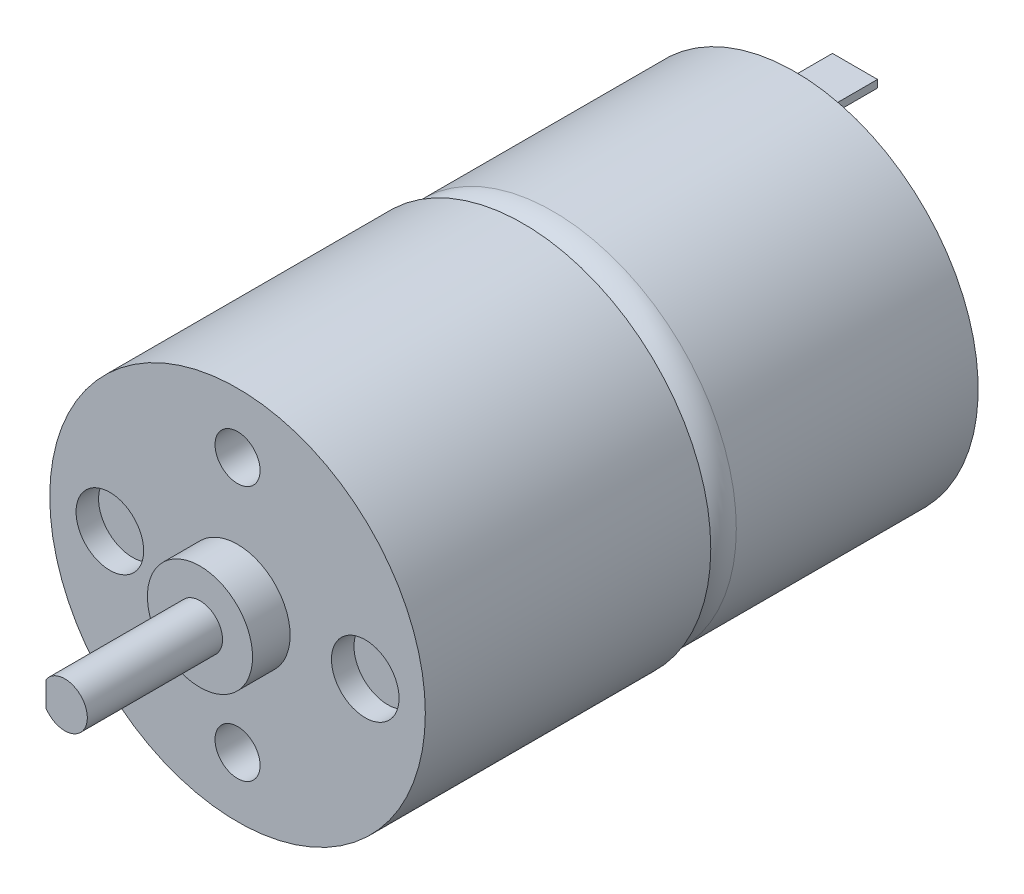
ISO-10303-21;
HEADER;
FILE_DESCRIPTION(('STEP AP214'),'2;1');
FILE_NAME('part.step','',(''),(''),'','','');
FILE_SCHEMA(('AUTOMOTIVE_DESIGN { 1 0 10303 214 1 1 1 1 }'));
ENDSEC;
DATA;
#1=APPLICATION_CONTEXT('core data for automotive mechanical design processes');
#2=APPLICATION_PROTOCOL_DEFINITION('international standard','automotive_design',2000,#1);
#3=PRODUCT_CONTEXT('',#1,'mechanical');
#4=PRODUCT('Part','Part','',(#3));
#5=PRODUCT_RELATED_PRODUCT_CATEGORY('part','',(#4));
#6=PRODUCT_DEFINITION_FORMATION('','',#4);
#7=PRODUCT_DEFINITION_CONTEXT('part definition',#1,'design');
#8=PRODUCT_DEFINITION('design','',#6,#7);
#9=PRODUCT_DEFINITION_SHAPE('','',#8);
#10=(LENGTH_UNIT() NAMED_UNIT(*) SI_UNIT(.MILLI.,.METRE.));
#11=(NAMED_UNIT(*) PLANE_ANGLE_UNIT() SI_UNIT($,.RADIAN.));
#12=(NAMED_UNIT(*) SI_UNIT($,.STERADIAN.) SOLID_ANGLE_UNIT());
#13=UNCERTAINTY_MEASURE_WITH_UNIT(LENGTH_MEASURE(1.E-05),#10,'distance_accuracy_value','');
#14=(GEOMETRIC_REPRESENTATION_CONTEXT(3) GLOBAL_UNCERTAINTY_ASSIGNED_CONTEXT((#13)) GLOBAL_UNIT_ASSIGNED_CONTEXT((#10,
#11,#12)) REPRESENTATION_CONTEXT('',''));
#15=CARTESIAN_POINT('',(0.,0.,0.));
#16=DIRECTION('',(0.,0.,1.));
#17=DIRECTION('',(1.,0.,0.));
#18=AXIS2_PLACEMENT_3D('',#15,#16,#17);
#19=CARTESIAN_POINT('',(0.,0.,0.));
#20=DIRECTION('',(0.,0.,1.));
#21=DIRECTION('',(1.,0.,0.));
#22=AXIS2_PLACEMENT_3D('',#19,#20,#21);
#23=PLANE('',#22);
#24=DIRECTION('',(0.,-1.,0.));
#25=VECTOR('',#24,1.);
#26=CARTESIAN_POINT('',(1.5,10.5,0.));
#27=LINE('',#26,#25);
#28=CARTESIAN_POINT('',(1.5,10.5,0.));
#29=VERTEX_POINT('',#28);
#30=CARTESIAN_POINT('',(1.5,10.,0.));
#31=VERTEX_POINT('',#30);
#32=EDGE_CURVE('E130',#29,#31,#27,.T.);
#33=ORIENTED_EDGE('',*,*,#32,.F.);
#34=DIRECTION('',(1.,0.,0.));
#35=VECTOR('',#34,1.);
#36=CARTESIAN_POINT('',(1.5,10.5,0.));
#37=LINE('',#36,#35);
#38=CARTESIAN_POINT('',(-1.5,10.5,0.));
#39=VERTEX_POINT('',#38);
#40=EDGE_CURVE('E143',#39,#29,#37,.T.);
#41=ORIENTED_EDGE('',*,*,#40,.F.);
#42=DIRECTION('',(0.,1.,0.));
#43=VECTOR('',#42,1.);
#44=CARTESIAN_POINT('',(-1.5,10.5,0.));
#45=LINE('',#44,#43);
#46=CARTESIAN_POINT('',(-1.5,10.,0.));
#47=VERTEX_POINT('',#46);
#48=EDGE_CURVE('E152',#47,#39,#45,.T.);
#49=ORIENTED_EDGE('',*,*,#48,.F.);
#50=DIRECTION('',(-1.,0.,0.));
#51=VECTOR('',#50,1.);
#52=CARTESIAN_POINT('',(1.5,10.,0.));
#53=LINE('',#52,#51);
#54=EDGE_CURVE('E133',#31,#47,#53,.T.);
#55=ORIENTED_EDGE('',*,*,#54,.F.);
#56=EDGE_LOOP('',(#33,#41,#49,#55));
#57=FACE_BOUND('',#56,.T.);
#58=CARTESIAN_POINT('',(0.,0.,0.));
#59=DIRECTION('',(0.,0.,1.));
#60=DIRECTION('',(1.,0.,0.));
#61=AXIS2_PLACEMENT_3D('',#58,#59,#60);
#62=CIRCLE('',#61,12.2);
#63=CARTESIAN_POINT('',(-12.2,0.,0.));
#64=VERTEX_POINT('',#63);
#65=EDGE_CURVE('E223',#64,#64,#62,.T.);
#66=ORIENTED_EDGE('',*,*,#65,.F.);
#67=EDGE_LOOP('',(#66));
#68=FACE_BOUND('',#67,.T.);
#69=CARTESIAN_POINT('',(0.,0.,0.));
#70=DIRECTION('',(0.,0.,1.));
#71=DIRECTION('',(1.,0.,0.));
#72=AXIS2_PLACEMENT_3D('',#69,#70,#71);
#73=CIRCLE('',#72,3.25);
#74=CARTESIAN_POINT('',(3.25,0.,0.));
#75=VERTEX_POINT('',#74);
#76=EDGE_CURVE('E11',#75,#75,#73,.F.);
#77=ORIENTED_EDGE('',*,*,#76,.F.);
#78=EDGE_LOOP('',(#77));
#79=FACE_BOUND('',#78,.T.);
#80=DIRECTION('',(0.,-1.,0.));
#81=VECTOR('',#80,1.);
#82=CARTESIAN_POINT('',(1.5,-10.,0.));
#83=LINE('',#82,#81);
#84=CARTESIAN_POINT('',(1.5,-10.,0.));
#85=VERTEX_POINT('',#84);
#86=CARTESIAN_POINT('',(1.5,-10.5,0.));
#87=VERTEX_POINT('',#86);
#88=EDGE_CURVE('E129',#85,#87,#83,.T.);
#89=ORIENTED_EDGE('',*,*,#88,.F.);
#90=DIRECTION('',(1.,0.,0.));
#91=VECTOR('',#90,1.);
#92=CARTESIAN_POINT('',(1.5,-10.,0.));
#93=LINE('',#92,#91);
#94=CARTESIAN_POINT('',(-1.5,-10.,0.));
#95=VERTEX_POINT('',#94);
#96=EDGE_CURVE('E126',#95,#85,#93,.T.);
#97=ORIENTED_EDGE('',*,*,#96,.F.);
#98=DIRECTION('',(0.,1.,0.));
#99=VECTOR('',#98,1.);
#100=CARTESIAN_POINT('',(-1.5,-10.,0.));
#101=LINE('',#100,#99);
#102=CARTESIAN_POINT('',(-1.5,-10.5,0.));
#103=VERTEX_POINT('',#102);
#104=EDGE_CURVE('E52',#103,#95,#101,.T.);
#105=ORIENTED_EDGE('',*,*,#104,.F.);
#106=DIRECTION('',(-1.,0.,0.));
#107=VECTOR('',#106,1.);
#108=CARTESIAN_POINT('',(1.5,-10.5,0.));
#109=LINE('',#108,#107);
#110=EDGE_CURVE('E47',#87,#103,#109,.T.);
#111=ORIENTED_EDGE('',*,*,#110,.F.);
#112=EDGE_LOOP('',(#89,#97,#105,#111));
#113=FACE_BOUND('',#112,.T.);
#114=ADVANCED_FACE('F32',(#57,#68,#79,#113),#23,.F.);
#115=CARTESIAN_POINT('',(0.,0.,39.6));
#116=DIRECTION('',(0.,0.,1.));
#117=DIRECTION('',(1.,0.,0.));
#118=AXIS2_PLACEMENT_3D('',#115,#116,#117);
#119=PLANE('',#118);
#120=CARTESIAN_POINT('',(0.,0.,39.6));
#121=DIRECTION('',(0.,0.,1.));
#122=DIRECTION('',(1.,0.,0.));
#123=AXIS2_PLACEMENT_3D('',#120,#121,#122);
#124=CIRCLE('',#123,3.5);
#125=CARTESIAN_POINT('',(3.5,0.,39.6));
#126=VERTEX_POINT('',#125);
#127=EDGE_CURVE('E214',#126,#126,#124,.T.);
#128=ORIENTED_EDGE('',*,*,#127,.T.);
#129=EDGE_LOOP('',(#128));
#130=FACE_BOUND('',#129,.T.);
#131=CARTESIAN_POINT('',(0.,0.,39.6));
#132=DIRECTION('',(0.,0.,1.));
#133=DIRECTION('',(1.,0.,0.));
#134=AXIS2_PLACEMENT_3D('',#131,#132,#133);
#135=CIRCLE('',#134,1.5);
#136=CARTESIAN_POINT('',(1.5,0.,39.6));
#137=VERTEX_POINT('',#136);
#138=EDGE_CURVE('E206',#137,#137,#135,.T.);
#139=ORIENTED_EDGE('',*,*,#138,.F.);
#140=EDGE_LOOP('',(#139));
#141=FACE_BOUND('',#140,.T.);
#142=ADVANCED_FACE('F256',(#130,#141),#119,.T.);
#143=CARTESIAN_POINT('',(0.,0.,37.1));
#144=DIRECTION('',(0.,0.,1.));
#145=DIRECTION('',(1.,0.,0.));
#146=AXIS2_PLACEMENT_3D('',#143,#144,#145);
#147=PLANE('',#146);
#148=CARTESIAN_POINT('',(0.,-8.5,37.1));
#149=DIRECTION('',(0.,0.,1.));
#150=DIRECTION('',(1.,0.,0.));
#151=AXIS2_PLACEMENT_3D('',#148,#149,#150);
#152=CIRCLE('',#151,1.5);
#153=CARTESIAN_POINT('',(1.5,-8.5,37.1));
#154=VERTEX_POINT('',#153);
#155=EDGE_CURVE('E171',#154,#154,#152,.T.);
#156=ORIENTED_EDGE('',*,*,#155,.F.);
#157=EDGE_LOOP('',(#156));
#158=FACE_BOUND('',#157,.T.);
#159=CARTESIAN_POINT('',(0.,8.5,37.1));
#160=DIRECTION('',(0.,0.,1.));
#161=DIRECTION('',(1.,0.,0.));
#162=AXIS2_PLACEMENT_3D('',#159,#160,#161);
#163=CIRCLE('',#162,1.5);
#164=CARTESIAN_POINT('',(1.5,8.5,37.1));
#165=VERTEX_POINT('',#164);
#166=EDGE_CURVE('E175',#165,#165,#163,.T.);
#167=ORIENTED_EDGE('',*,*,#166,.F.);
#168=EDGE_LOOP('',(#167));
#169=FACE_BOUND('',#168,.T.);
#170=CARTESIAN_POINT('',(-8.5,0.,37.1));
#171=DIRECTION('',(0.,0.,1.));
#172=DIRECTION('',(1.,0.,0.));
#173=AXIS2_PLACEMENT_3D('',#170,#171,#172);
#174=CIRCLE('',#173,2.25);
#175=CARTESIAN_POINT('',(-6.25,0.,37.1));
#176=VERTEX_POINT('',#175);
#177=EDGE_CURVE('E181',#176,#176,#174,.T.);
#178=ORIENTED_EDGE('',*,*,#177,.F.);
#179=EDGE_LOOP('',(#178));
#180=FACE_BOUND('',#179,.T.);
#181=CARTESIAN_POINT('',(8.5,0.,37.1));
#182=DIRECTION('',(0.,0.,1.));
#183=DIRECTION('',(1.,0.,0.));
#184=AXIS2_PLACEMENT_3D('',#181,#182,#183);
#185=CIRCLE('',#184,2.25);
#186=CARTESIAN_POINT('',(10.75,0.,37.1));
#187=VERTEX_POINT('',#186);
#188=EDGE_CURVE('E187',#187,#187,#185,.T.);
#189=ORIENTED_EDGE('',*,*,#188,.F.);
#190=EDGE_LOOP('',(#189));
#191=FACE_BOUND('',#190,.T.);
#192=CARTESIAN_POINT('',(0.,0.,37.1));
#193=DIRECTION('',(0.,0.,1.));
#194=DIRECTION('',(1.,0.,0.));
#195=AXIS2_PLACEMENT_3D('',#192,#193,#194);
#196=CIRCLE('',#195,12.5);
#197=CARTESIAN_POINT('',(12.5,0.,37.1));
#198=VERTEX_POINT('',#197);
#199=EDGE_CURVE('E220',#198,#198,#196,.T.);
#200=ORIENTED_EDGE('',*,*,#199,.T.);
#201=EDGE_LOOP('',(#200));
#202=FACE_BOUND('',#201,.T.);
#203=CARTESIAN_POINT('',(0.,0.,37.1));
#204=DIRECTION('',(0.,0.,1.));
#205=DIRECTION('',(1.,0.,0.));
#206=AXIS2_PLACEMENT_3D('',#203,#204,#205);
#207=CIRCLE('',#206,3.5);
#208=CARTESIAN_POINT('',(3.5,0.,37.1));
#209=VERTEX_POINT('',#208);
#210=EDGE_CURVE('E211',#209,#209,#207,.T.);
#211=ORIENTED_EDGE('',*,*,#210,.F.);
#212=EDGE_LOOP('',(#211));
#213=FACE_BOUND('',#212,.T.);
#214=ADVANCED_FACE('F261',(#158,#169,#180,#191,#202,#213),#147,.T.);
#215=CARTESIAN_POINT('',(0.,0.,18.1));
#216=DIRECTION('',(0.,0.,-1.));
#217=DIRECTION('',(-1.,0.,0.));
#218=AXIS2_PLACEMENT_3D('',#215,#216,#217);
#219=CYLINDRICAL_SURFACE('',#218,12.2);
#220=CARTESIAN_POINT('',(0.,0.,16.1));
#221=DIRECTION('',(0.,0.,1.));
#222=DIRECTION('',(1.,0.,0.));
#223=AXIS2_PLACEMENT_3D('',#220,#221,#222);
#224=CIRCLE('',#223,12.2);
#225=CARTESIAN_POINT('',(-12.2,0.,16.1));
#226=VERTEX_POINT('',#225);
#227=EDGE_CURVE('E40',#226,#226,#224,.F.);
#228=CARTESIAN_POINT('',(-12.2,0.,16.1));
#229=CARTESIAN_POINT('',(-12.2,0.,15.9322916666667));
#230=CARTESIAN_POINT('',(-12.2,0.,15.7645833333333));
#231=CARTESIAN_POINT('',(-12.2,0.,15.4291666666667));
#232=CARTESIAN_POINT('',(-12.2,0.,15.2614583333333));
#233=CARTESIAN_POINT('',(-12.2,0.,14.9260416666667));
#234=CARTESIAN_POINT('',(-12.2,0.,14.7583333333333));
#235=CARTESIAN_POINT('',(-12.2,0.,14.4229166666667));
#236=CARTESIAN_POINT('',(-12.2,0.,14.2552083333333));
#237=CARTESIAN_POINT('',(-12.2,0.,13.9197916666667));
#238=CARTESIAN_POINT('',(-12.2,0.,13.7520833333333));
#239=CARTESIAN_POINT('',(-12.2,0.,13.4166666666667));
#240=CARTESIAN_POINT('',(-12.2,0.,13.2489583333333));
#241=CARTESIAN_POINT('',(-12.2,0.,12.9135416666667));
#242=CARTESIAN_POINT('',(-12.2,0.,12.7458333333333));
#243=CARTESIAN_POINT('',(-12.2,0.,12.4104166666667));
#244=CARTESIAN_POINT('',(-12.2,0.,12.2427083333333));
#245=CARTESIAN_POINT('',(-12.2,0.,11.9072916666667));
#246=CARTESIAN_POINT('',(-12.2,0.,11.7395833333333));
#247=CARTESIAN_POINT('',(-12.2,0.,11.4041666666667));
#248=CARTESIAN_POINT('',(-12.2,0.,11.2364583333333));
#249=CARTESIAN_POINT('',(-12.2,0.,10.9010416666667));
#250=CARTESIAN_POINT('',(-12.2,0.,10.7333333333333));
#251=CARTESIAN_POINT('',(-12.2,0.,10.3979166666667));
#252=CARTESIAN_POINT('',(-12.2,0.,10.2302083333333));
#253=CARTESIAN_POINT('',(-12.2,0.,9.89479166666667));
#254=CARTESIAN_POINT('',(-12.2,0.,9.72708333333333));
#255=CARTESIAN_POINT('',(-12.2,0.,9.39166666666667));
#256=CARTESIAN_POINT('',(-12.2,0.,9.22395833333333));
#257=CARTESIAN_POINT('',(-12.2,0.,8.88854166666667));
#258=CARTESIAN_POINT('',(-12.2,0.,8.72083333333333));
#259=CARTESIAN_POINT('',(-12.2,0.,8.38541666666667));
#260=CARTESIAN_POINT('',(-12.2,0.,8.21770833333333));
#261=CARTESIAN_POINT('',(-12.2,0.,7.88229166666667));
#262=CARTESIAN_POINT('',(-12.2,0.,7.71458333333333));
#263=CARTESIAN_POINT('',(-12.2,0.,7.37916666666667));
#264=CARTESIAN_POINT('',(-12.2,0.,7.21145833333333));
#265=CARTESIAN_POINT('',(-12.2,0.,6.87604166666667));
#266=CARTESIAN_POINT('',(-12.2,0.,6.70833333333333));
#267=CARTESIAN_POINT('',(-12.2,0.,6.37291666666667));
#268=CARTESIAN_POINT('',(-12.2,0.,6.20520833333333));
#269=CARTESIAN_POINT('',(-12.2,0.,5.86979166666667));
#270=CARTESIAN_POINT('',(-12.2,0.,5.70208333333333));
#271=CARTESIAN_POINT('',(-12.2,0.,5.36666666666667));
#272=CARTESIAN_POINT('',(-12.2,0.,5.19895833333333));
#273=CARTESIAN_POINT('',(-12.2,0.,4.86354166666667));
#274=CARTESIAN_POINT('',(-12.2,0.,4.69583333333333));
#275=CARTESIAN_POINT('',(-12.2,0.,4.36041666666667));
#276=CARTESIAN_POINT('',(-12.2,0.,4.19270833333333));
#277=CARTESIAN_POINT('',(-12.2,0.,3.85729166666667));
#278=CARTESIAN_POINT('',(-12.2,0.,3.68958333333333));
#279=CARTESIAN_POINT('',(-12.2,0.,3.35416666666667));
#280=CARTESIAN_POINT('',(-12.2,0.,3.18645833333333));
#281=CARTESIAN_POINT('',(-12.2,0.,2.85104166666667));
#282=CARTESIAN_POINT('',(-12.2,0.,2.68333333333333));
#283=CARTESIAN_POINT('',(-12.2,0.,2.34791666666667));
#284=CARTESIAN_POINT('',(-12.2,0.,2.18020833333333));
#285=CARTESIAN_POINT('',(-12.2,0.,1.84479166666667));
#286=CARTESIAN_POINT('',(-12.2,0.,1.67708333333333));
#287=CARTESIAN_POINT('',(-12.2,0.,1.34166666666667));
#288=CARTESIAN_POINT('',(-12.2,0.,1.17395833333333));
#289=CARTESIAN_POINT('',(-12.2,0.,0.838541666666667));
#290=CARTESIAN_POINT('',(-12.2,0.,0.670833333333333));
#291=CARTESIAN_POINT('',(-12.2,0.,0.335416666666667));
#292=CARTESIAN_POINT('',(-12.2,0.,0.167708333333333));
#293=CARTESIAN_POINT('',(-12.2,0.,0.));
#294=B_SPLINE_CURVE_WITH_KNOTS('',3,(#228,#229,#230,#231,#232,#233,#234,#235,#236,#237,#238,
#239,#240,#241,#242,#243,#244,#245,#246,#247,#248,#249,#250,#251,#252,#253,#254,#255,#256,#257,
#258,#259,#260,#261,#262,#263,#264,#265,#266,#267,#268,#269,#270,#271,#272,#273,#274,#275,#276,
#277,#278,#279,#280,#281,#282,#283,#284,#285,#286,#287,#288,#289,#290,#291,#292,#293),
.UNSPECIFIED.,.F.,.F.,(4,2,2,2,2,2,2,2,2,2,2,2,2,2,2,2,2,2,2,2,2,2,2,2,2,2,2,2,2,2,2,2,4),(0.,
0.503124999999998,1.00625,1.509375,2.0125,2.515625,3.01875,3.521875,4.025,4.528125,5.03125,
5.534375,6.0375,6.540625,7.04375,7.546875,8.05,8.553125,9.05625,9.559375,10.0625,10.565625,
11.06875,11.571875,12.075,12.578125,13.08125,13.584375,14.0875,14.590625,15.09375,15.596875,
16.1),.UNSPECIFIED.);
#295=EDGE_CURVE('BSEAM233',#226,#64,#294,.T.);
#296=ORIENTED_EDGE('',*,*,#227,.T.);
#297=ORIENTED_EDGE('',*,*,#65,.T.);
#298=ORIENTED_EDGE('',*,*,#295,.T.);
#299=ORIENTED_EDGE('',*,*,#295,.F.);
#300=EDGE_LOOP('',(#296,#298,#297,#299));
#301=FACE_BOUND('',#300,.T.);
#302=ADVANCED_FACE('F233',(#301),#219,.T.);
#303=CARTESIAN_POINT('',(0.,0.,16.1));
#304=DIRECTION('',(0.,0.,1.));
#305=DIRECTION('',(1.,0.,0.));
#306=AXIS2_PLACEMENT_3D('',#303,#304,#305);
#307=TOROIDAL_SURFACE('',#306,10.2,2.);
#308=ORIENTED_EDGE('',*,*,#227,.F.);
#309=EDGE_LOOP('',(#308));
#310=FACE_BOUND('',#309,.T.);
#311=CARTESIAN_POINT('',(0.,0.,18.1));
#312=DIRECTION('',(0.,0.,1.));
#313=DIRECTION('',(1.,0.,0.));
#314=AXIS2_PLACEMENT_3D('',#311,#312,#313);
#315=CIRCLE('',#314,10.2);
#316=CARTESIAN_POINT('',(10.2,0.,18.1));
#317=VERTEX_POINT('',#316);
#318=EDGE_CURVE('E228',#317,#317,#315,.T.);
#319=ORIENTED_EDGE('',*,*,#318,.F.);
#320=EDGE_LOOP('',(#319));
#321=FACE_BOUND('',#320,.T.);
#322=ADVANCED_FACE('F34',(#310,#321),#307,.T.);
#323=CARTESIAN_POINT('',(0.,0.,37.1));
#324=DIRECTION('',(0.,0.,-1.));
#325=DIRECTION('',(-1.,0.,0.));
#326=AXIS2_PLACEMENT_3D('',#323,#324,#325);
#327=CYLINDRICAL_SURFACE('',#326,12.5);
#328=ORIENTED_EDGE('',*,*,#199,.F.);
#329=EDGE_LOOP('',(#328));
#330=FACE_BOUND('',#329,.T.);
#331=CARTESIAN_POINT('',(0.,0.,18.1));
#332=DIRECTION('',(0.,0.,1.));
#333=DIRECTION('',(1.,0.,0.));
#334=AXIS2_PLACEMENT_3D('',#331,#332,#333);
#335=CIRCLE('',#334,12.5);
#336=CARTESIAN_POINT('',(12.5,0.,18.1));
#337=VERTEX_POINT('',#336);
#338=EDGE_CURVE('E217',#337,#337,#335,.T.);
#339=ORIENTED_EDGE('',*,*,#338,.T.);
#340=EDGE_LOOP('',(#339));
#341=FACE_BOUND('',#340,.T.);
#342=ADVANCED_FACE('F238',(#330,#341),#327,.T.);
#343=CARTESIAN_POINT('',(0.,0.,18.1));
#344=DIRECTION('',(0.,0.,1.));
#345=DIRECTION('',(1.,0.,0.));
#346=AXIS2_PLACEMENT_3D('',#343,#344,#345);
#347=PLANE('',#346);
#348=ORIENTED_EDGE('',*,*,#318,.T.);
#349=EDGE_LOOP('',(#348));
#350=FACE_BOUND('',#349,.T.);
#351=ORIENTED_EDGE('',*,*,#338,.F.);
#352=EDGE_LOOP('',(#351));
#353=FACE_BOUND('',#352,.T.);
#354=ADVANCED_FACE('F241',(#350,#353),#347,.F.);
#355=CARTESIAN_POINT('',(0.,0.,39.6));
#356=DIRECTION('',(0.,0.,-1.));
#357=DIRECTION('',(-1.,0.,0.));
#358=AXIS2_PLACEMENT_3D('',#355,#356,#357);
#359=CYLINDRICAL_SURFACE('',#358,3.5);
#360=ORIENTED_EDGE('',*,*,#127,.F.);
#361=EDGE_LOOP('',(#360));
#362=FACE_BOUND('',#361,.T.);
#363=ORIENTED_EDGE('',*,*,#210,.T.);
#364=EDGE_LOOP('',(#363));
#365=FACE_BOUND('',#364,.T.);
#366=ADVANCED_FACE('F244',(#362,#365),#359,.T.);
#367=CARTESIAN_POINT('',(0.,0.,48.6));
#368=DIRECTION('',(0.,0.,-1.));
#369=DIRECTION('',(-1.,0.,0.));
#370=AXIS2_PLACEMENT_3D('',#367,#368,#369);
#371=CYLINDRICAL_SURFACE('',#370,1.5);
#372=CARTESIAN_POINT('',(0.,0.,48.6));
#373=DIRECTION('',(0.,0.,1.));
#374=DIRECTION('',(1.,0.,0.));
#375=AXIS2_PLACEMENT_3D('',#372,#373,#374);
#376=CIRCLE('',#375,1.5);
#377=CARTESIAN_POINT('',(-1.25,-0.829156197588851,48.6));
#378=VERTEX_POINT('',#377);
#379=CARTESIAN_POINT('',(-1.25,0.829156197588851,48.6));
#380=VERTEX_POINT('',#379);
#381=EDGE_CURVE('E208',#378,#380,#376,.T.);
#382=ORIENTED_EDGE('',*,*,#381,.F.);
#383=DIRECTION('',(0.,0.,1.));
#384=VECTOR('',#383,1.);
#385=CARTESIAN_POINT('',(-1.25,-0.829156197588851,40.6));
#386=LINE('',#385,#384);
#387=CARTESIAN_POINT('',(-1.25,-0.829156197588851,40.6));
#388=VERTEX_POINT('',#387);
#389=EDGE_CURVE('E201',#388,#378,#386,.T.);
#390=ORIENTED_EDGE('',*,*,#389,.F.);
#391=CARTESIAN_POINT('',(0.,0.,40.6));
#392=DIRECTION('',(0.,0.,1.));
#393=DIRECTION('',(1.,0.,0.));
#394=AXIS2_PLACEMENT_3D('',#391,#392,#393);
#395=CIRCLE('',#394,1.5);
#396=CARTESIAN_POINT('',(-1.25,0.829156197588851,40.6));
#397=VERTEX_POINT('',#396);
#398=EDGE_CURVE('E196',#397,#388,#395,.T.);
#399=ORIENTED_EDGE('',*,*,#398,.F.);
#400=DIRECTION('',(0.,0.,1.));
#401=VECTOR('',#400,1.);
#402=CARTESIAN_POINT('',(-1.25,0.829156197588851,40.6));
#403=LINE('',#402,#401);
#404=EDGE_CURVE('E203',#397,#380,#403,.T.);
#405=ORIENTED_EDGE('',*,*,#404,.T.);
#406=EDGE_LOOP('',(#382,#390,#399,#405));
#407=FACE_BOUND('',#406,.T.);
#408=ORIENTED_EDGE('',*,*,#138,.T.);
#409=EDGE_LOOP('',(#408));
#410=FACE_BOUND('',#409,.T.);
#411=ADVANCED_FACE('F277',(#407,#410),#371,.T.);
#412=CARTESIAN_POINT('',(0.,0.,48.6));
#413=DIRECTION('',(0.,0.,1.));
#414=DIRECTION('',(1.,0.,0.));
#415=AXIS2_PLACEMENT_3D('',#412,#413,#414);
#416=PLANE('',#415);
#417=DIRECTION('',(0.,1.,0.));
#418=VECTOR('',#417,1.);
#419=CARTESIAN_POINT('',(-1.25,0.,48.6));
#420=LINE('',#419,#418);
#421=EDGE_CURVE('E193',#378,#380,#420,.T.);
#422=ORIENTED_EDGE('',*,*,#421,.F.);
#423=ORIENTED_EDGE('',*,*,#381,.T.);
#424=EDGE_LOOP('',(#422,#423));
#425=FACE_BOUND('',#424,.T.);
#426=ADVANCED_FACE('F282',(#425),#416,.T.);
#427=CARTESIAN_POINT('',(-1.25,0.,40.6));
#428=DIRECTION('',(1.,0.,0.));
#429=DIRECTION('',(0.,0.,-1.));
#430=AXIS2_PLACEMENT_3D('',#427,#428,#429);
#431=PLANE('',#430);
#432=ORIENTED_EDGE('',*,*,#421,.T.);
#433=ORIENTED_EDGE('',*,*,#404,.F.);
#434=DIRECTION('',(0.,1.,0.));
#435=VECTOR('',#434,1.);
#436=CARTESIAN_POINT('',(-1.25,0.,40.6));
#437=LINE('',#436,#435);
#438=EDGE_CURVE('E198',#388,#397,#437,.T.);
#439=ORIENTED_EDGE('',*,*,#438,.F.);
#440=ORIENTED_EDGE('',*,*,#389,.T.);
#441=EDGE_LOOP('',(#432,#433,#439,#440));
#442=FACE_BOUND('',#441,.T.);
#443=ADVANCED_FACE('F286',(#442),#431,.F.);
#444=CARTESIAN_POINT('',(0.,0.,40.6));
#445=DIRECTION('',(0.,0.,1.));
#446=DIRECTION('',(1.,0.,0.));
#447=AXIS2_PLACEMENT_3D('',#444,#445,#446);
#448=PLANE('',#447);
#449=ORIENTED_EDGE('',*,*,#398,.T.);
#450=ORIENTED_EDGE('',*,*,#438,.T.);
#451=EDGE_LOOP('',(#449,#450));
#452=FACE_BOUND('',#451,.T.);
#453=ADVANCED_FACE('F290',(#452),#448,.T.);
#454=CARTESIAN_POINT('',(8.5,0.,35.6));
#455=DIRECTION('',(0.,0.,1.));
#456=DIRECTION('',(1.,0.,0.));
#457=AXIS2_PLACEMENT_3D('',#454,#455,#456);
#458=CYLINDRICAL_SURFACE('',#457,2.25);
#459=CARTESIAN_POINT('',(8.5,0.,35.6));
#460=DIRECTION('',(0.,0.,1.));
#461=DIRECTION('',(1.,0.,0.));
#462=AXIS2_PLACEMENT_3D('',#459,#460,#461);
#463=CIRCLE('',#462,2.25);
#464=CARTESIAN_POINT('',(10.75,0.,35.6));
#465=VERTEX_POINT('',#464);
#466=EDGE_CURVE('E190',#465,#465,#463,.T.);
#467=ORIENTED_EDGE('',*,*,#466,.F.);
#468=EDGE_LOOP('',(#467));
#469=FACE_BOUND('',#468,.T.);
#470=ORIENTED_EDGE('',*,*,#188,.T.);
#471=EDGE_LOOP('',(#470));
#472=FACE_BOUND('',#471,.T.);
#473=ADVANCED_FACE('F294',(#469,#472),#458,.F.);
#474=CARTESIAN_POINT('',(8.5,0.,35.6));
#475=DIRECTION('',(0.,0.,1.));
#476=DIRECTION('',(1.,0.,0.));
#477=AXIS2_PLACEMENT_3D('',#474,#475,#476);
#478=PLANE('',#477);
#479=ORIENTED_EDGE('',*,*,#466,.T.);
#480=EDGE_LOOP('',(#479));
#481=FACE_BOUND('',#480,.T.);
#482=ADVANCED_FACE('F298',(#481),#478,.T.);
#483=CARTESIAN_POINT('',(-8.5,0.,35.6));
#484=DIRECTION('',(0.,0.,1.));
#485=DIRECTION('',(1.,0.,0.));
#486=AXIS2_PLACEMENT_3D('',#483,#484,#485);
#487=CYLINDRICAL_SURFACE('',#486,2.25);
#488=CARTESIAN_POINT('',(-8.5,0.,35.6));
#489=DIRECTION('',(0.,0.,1.));
#490=DIRECTION('',(1.,0.,0.));
#491=AXIS2_PLACEMENT_3D('',#488,#489,#490);
#492=CIRCLE('',#491,2.25);
#493=CARTESIAN_POINT('',(-6.25,0.,35.6));
#494=VERTEX_POINT('',#493);
#495=EDGE_CURVE('E184',#494,#494,#492,.T.);
#496=ORIENTED_EDGE('',*,*,#495,.F.);
#497=EDGE_LOOP('',(#496));
#498=FACE_BOUND('',#497,.T.);
#499=ORIENTED_EDGE('',*,*,#177,.T.);
#500=EDGE_LOOP('',(#499));
#501=FACE_BOUND('',#500,.T.);
#502=ADVANCED_FACE('F302',(#498,#501),#487,.F.);
#503=CARTESIAN_POINT('',(-8.5,0.,35.6));
#504=DIRECTION('',(0.,0.,1.));
#505=DIRECTION('',(1.,0.,0.));
#506=AXIS2_PLACEMENT_3D('',#503,#504,#505);
#507=PLANE('',#506);
#508=ORIENTED_EDGE('',*,*,#495,.T.);
#509=EDGE_LOOP('',(#508));
#510=FACE_BOUND('',#509,.T.);
#511=ADVANCED_FACE('F306',(#510),#507,.T.);
#512=CARTESIAN_POINT('',(0.,8.5,31.1));
#513=DIRECTION('',(0.,0.,1.));
#514=DIRECTION('',(1.,0.,0.));
#515=AXIS2_PLACEMENT_3D('',#512,#513,#514);
#516=CYLINDRICAL_SURFACE('',#515,1.5);
#517=CARTESIAN_POINT('',(0.,8.5,31.1));
#518=DIRECTION('',(0.,0.,1.));
#519=DIRECTION('',(1.,0.,0.));
#520=AXIS2_PLACEMENT_3D('',#517,#518,#519);
#521=CIRCLE('',#520,1.5);
#522=CARTESIAN_POINT('',(1.5,8.5,31.1));
#523=VERTEX_POINT('',#522);
#524=EDGE_CURVE('E178',#523,#523,#521,.T.);
#525=ORIENTED_EDGE('',*,*,#524,.F.);
#526=EDGE_LOOP('',(#525));
#527=FACE_BOUND('',#526,.T.);
#528=ORIENTED_EDGE('',*,*,#166,.T.);
#529=EDGE_LOOP('',(#528));
#530=FACE_BOUND('',#529,.T.);
#531=ADVANCED_FACE('F310',(#527,#530),#516,.F.);
#532=CARTESIAN_POINT('',(0.,8.5,31.1));
#533=DIRECTION('',(0.,0.,1.));
#534=DIRECTION('',(1.,0.,0.));
#535=AXIS2_PLACEMENT_3D('',#532,#533,#534);
#536=PLANE('',#535);
#537=ORIENTED_EDGE('',*,*,#524,.T.);
#538=EDGE_LOOP('',(#537));
#539=FACE_BOUND('',#538,.T.);
#540=ADVANCED_FACE('F314',(#539),#536,.T.);
#541=CARTESIAN_POINT('',(0.,-8.5,31.1));
#542=DIRECTION('',(0.,0.,1.));
#543=DIRECTION('',(1.,0.,0.));
#544=AXIS2_PLACEMENT_3D('',#541,#542,#543);
#545=CYLINDRICAL_SURFACE('',#544,1.5);
#546=CARTESIAN_POINT('',(0.,-8.5,31.1));
#547=DIRECTION('',(0.,0.,1.));
#548=DIRECTION('',(1.,0.,0.));
#549=AXIS2_PLACEMENT_3D('',#546,#547,#548);
#550=CIRCLE('',#549,1.5);
#551=CARTESIAN_POINT('',(1.5,-8.5,31.1));
#552=VERTEX_POINT('',#551);
#553=EDGE_CURVE('E172',#552,#552,#550,.T.);
#554=ORIENTED_EDGE('',*,*,#553,.F.);
#555=EDGE_LOOP('',(#554));
#556=FACE_BOUND('',#555,.T.);
#557=ORIENTED_EDGE('',*,*,#155,.T.);
#558=EDGE_LOOP('',(#557));
#559=FACE_BOUND('',#558,.T.);
#560=ADVANCED_FACE('F318',(#556,#559),#545,.F.);
#561=CARTESIAN_POINT('',(0.,-8.5,31.1));
#562=DIRECTION('',(0.,0.,1.));
#563=DIRECTION('',(1.,0.,0.));
#564=AXIS2_PLACEMENT_3D('',#561,#562,#563);
#565=PLANE('',#564);
#566=ORIENTED_EDGE('',*,*,#553,.T.);
#567=EDGE_LOOP('',(#566));
#568=FACE_BOUND('',#567,.T.);
#569=ADVANCED_FACE('F322',(#568),#565,.T.);
#570=CARTESIAN_POINT('',(0.,0.,-2.));
#571=DIRECTION('',(0.,0.,1.));
#572=DIRECTION('',(1.,0.,0.));
#573=AXIS2_PLACEMENT_3D('',#570,#571,#572);
#574=CYLINDRICAL_SURFACE('',#573,3.25);
#575=CARTESIAN_POINT('',(0.,0.,-2.));
#576=DIRECTION('',(0.,0.,-1.));
#577=DIRECTION('',(-1.,0.,0.));
#578=AXIS2_PLACEMENT_3D('',#575,#576,#577);
#579=CIRCLE('',#578,3.25);
#580=CARTESIAN_POINT('',(-3.25,0.,-2.));
#581=VERTEX_POINT('',#580);
#582=EDGE_CURVE('E168',#581,#581,#579,.T.);
#583=ORIENTED_EDGE('',*,*,#582,.F.);
#584=EDGE_LOOP('',(#583));
#585=FACE_BOUND('',#584,.T.);
#586=ORIENTED_EDGE('',*,*,#76,.T.);
#587=EDGE_LOOP('',(#586));
#588=FACE_BOUND('',#587,.T.);
#589=ADVANCED_FACE('F326',(#585,#588),#574,.T.);
#590=CARTESIAN_POINT('',(0.,0.,-2.));
#591=DIRECTION('',(0.,0.,-1.));
#592=DIRECTION('',(-1.,0.,0.));
#593=AXIS2_PLACEMENT_3D('',#590,#591,#592);
#594=PLANE('',#593);
#595=ORIENTED_EDGE('',*,*,#582,.T.);
#596=EDGE_LOOP('',(#595));
#597=FACE_BOUND('',#596,.T.);
#598=ADVANCED_FACE('F330',(#597),#594,.T.);
#599=CARTESIAN_POINT('',(1.5,10.5,-4.));
#600=DIRECTION('',(-1.,0.,0.));
#601=DIRECTION('',(0.,-1.,0.));
#602=AXIS2_PLACEMENT_3D('',#599,#600,#601);
#603=PLANE('',#602);
#604=ORIENTED_EDGE('',*,*,#32,.T.);
#605=DIRECTION('',(0.,0.,1.));
#606=VECTOR('',#605,1.);
#607=CARTESIAN_POINT('',(1.5,10.,-4.));
#608=LINE('',#607,#606);
#609=CARTESIAN_POINT('',(1.5,10.,-4.));
#610=VERTEX_POINT('',#609);
#611=EDGE_CURVE('E165',#610,#31,#608,.T.);
#612=ORIENTED_EDGE('',*,*,#611,.F.);
#613=DIRECTION('',(0.,-1.,0.));
#614=VECTOR('',#613,1.);
#615=CARTESIAN_POINT('',(1.5,10.5,-4.));
#616=LINE('',#615,#614);
#617=CARTESIAN_POINT('',(1.5,10.5,-4.));
#618=VERTEX_POINT('',#617);
#619=EDGE_CURVE('E139',#618,#610,#616,.T.);
#620=ORIENTED_EDGE('',*,*,#619,.F.);
#621=DIRECTION('',(0.,0.,1.));
#622=VECTOR('',#621,1.);
#623=CARTESIAN_POINT('',(1.5,10.5,-4.));
#624=LINE('',#623,#622);
#625=EDGE_CURVE('E148',#618,#29,#624,.T.);
#626=ORIENTED_EDGE('',*,*,#625,.T.);
#627=EDGE_LOOP('',(#604,#612,#620,#626));
#628=FACE_BOUND('',#627,.T.);
#629=ADVANCED_FACE('F334',(#628),#603,.F.);
#630=CARTESIAN_POINT('',(1.5,10.,-4.));
#631=DIRECTION('',(0.,1.,0.));
#632=DIRECTION('',(0.,0.,1.));
#633=AXIS2_PLACEMENT_3D('',#630,#631,#632);
#634=PLANE('',#633);
#635=ORIENTED_EDGE('',*,*,#54,.T.);
#636=DIRECTION('',(0.,0.,1.));
#637=VECTOR('',#636,1.);
#638=CARTESIAN_POINT('',(-1.5,10.,-4.));
#639=LINE('',#638,#637);
#640=CARTESIAN_POINT('',(-1.5,10.,-4.));
#641=VERTEX_POINT('',#640);
#642=EDGE_CURVE('E162',#641,#47,#639,.T.);
#643=ORIENTED_EDGE('',*,*,#642,.F.);
#644=DIRECTION('',(-1.,0.,0.));
#645=VECTOR('',#644,1.);
#646=CARTESIAN_POINT('',(1.5,10.,-4.));
#647=LINE('',#646,#645);
#648=EDGE_CURVE('E142',#610,#641,#647,.T.);
#649=ORIENTED_EDGE('',*,*,#648,.F.);
#650=ORIENTED_EDGE('',*,*,#611,.T.);
#651=EDGE_LOOP('',(#635,#643,#649,#650));
#652=FACE_BOUND('',#651,.T.);
#653=ADVANCED_FACE('F338',(#652),#634,.F.);
#654=CARTESIAN_POINT('',(-1.5,10.5,-4.));
#655=DIRECTION('',(1.,0.,0.));
#656=DIRECTION('',(0.,1.,0.));
#657=AXIS2_PLACEMENT_3D('',#654,#655,#656);
#658=PLANE('',#657);
#659=ORIENTED_EDGE('',*,*,#48,.T.);
#660=DIRECTION('',(0.,0.,1.));
#661=VECTOR('',#660,1.);
#662=CARTESIAN_POINT('',(-1.5,10.5,-4.));
#663=LINE('',#662,#661);
#664=CARTESIAN_POINT('',(-1.5,10.5,-4.));
#665=VERTEX_POINT('',#664);
#666=EDGE_CURVE('E159',#665,#39,#663,.T.);
#667=ORIENTED_EDGE('',*,*,#666,.F.);
#668=DIRECTION('',(0.,1.,0.));
#669=VECTOR('',#668,1.);
#670=CARTESIAN_POINT('',(-1.5,10.5,-4.));
#671=LINE('',#670,#669);
#672=EDGE_CURVE('E145',#641,#665,#671,.T.);
#673=ORIENTED_EDGE('',*,*,#672,.F.);
#674=ORIENTED_EDGE('',*,*,#642,.T.);
#675=EDGE_LOOP('',(#659,#667,#673,#674));
#676=FACE_BOUND('',#675,.T.);
#677=ADVANCED_FACE('F342',(#676),#658,.F.);
#678=CARTESIAN_POINT('',(1.5,10.5,-4.));
#679=DIRECTION('',(0.,-1.,0.));
#680=DIRECTION('',(0.,0.,-1.));
#681=AXIS2_PLACEMENT_3D('',#678,#679,#680);
#682=PLANE('',#681);
#683=ORIENTED_EDGE('',*,*,#40,.T.);
#684=ORIENTED_EDGE('',*,*,#625,.F.);
#685=DIRECTION('',(1.,0.,0.));
#686=VECTOR('',#685,1.);
#687=CARTESIAN_POINT('',(1.5,10.5,-4.));
#688=LINE('',#687,#686);
#689=EDGE_CURVE('E147',#665,#618,#688,.T.);
#690=ORIENTED_EDGE('',*,*,#689,.F.);
#691=ORIENTED_EDGE('',*,*,#666,.T.);
#692=EDGE_LOOP('',(#683,#684,#690,#691));
#693=FACE_BOUND('',#692,.T.);
#694=ADVANCED_FACE('F346',(#693),#682,.F.);
#695=CARTESIAN_POINT('',(0.,0.,-4.));
#696=DIRECTION('',(0.,0.,-1.));
#697=DIRECTION('',(-1.,0.,0.));
#698=AXIS2_PLACEMENT_3D('',#695,#696,#697);
#699=PLANE('',#698);
#700=ORIENTED_EDGE('',*,*,#619,.T.);
#701=ORIENTED_EDGE('',*,*,#648,.T.);
#702=ORIENTED_EDGE('',*,*,#672,.T.);
#703=ORIENTED_EDGE('',*,*,#689,.T.);
#704=EDGE_LOOP('',(#700,#701,#702,#703));
#705=FACE_BOUND('',#704,.T.);
#706=ADVANCED_FACE('F350',(#705),#699,.T.);
#707=CARTESIAN_POINT('',(1.5,-10.,-4.));
#708=DIRECTION('',(-1.,0.,0.));
#709=DIRECTION('',(0.,-1.,0.));
#710=AXIS2_PLACEMENT_3D('',#707,#708,#709);
#711=PLANE('',#710);
#712=ORIENTED_EDGE('',*,*,#88,.T.);
#713=DIRECTION('',(0.,0.,1.));
#714=VECTOR('',#713,1.);
#715=CARTESIAN_POINT('',(1.5,-10.5,-4.));
#716=LINE('',#715,#714);
#717=CARTESIAN_POINT('',(1.5,-10.5,-4.));
#718=VERTEX_POINT('',#717);
#719=EDGE_CURVE('E110',#718,#87,#716,.T.);
#720=ORIENTED_EDGE('',*,*,#719,.F.);
#721=DIRECTION('',(0.,-1.,0.));
#722=VECTOR('',#721,1.);
#723=CARTESIAN_POINT('',(1.5,-10.,-4.));
#724=LINE('',#723,#722);
#725=CARTESIAN_POINT('',(1.5,-10.,-4.));
#726=VERTEX_POINT('',#725);
#727=EDGE_CURVE('E117',#726,#718,#724,.T.);
#728=ORIENTED_EDGE('',*,*,#727,.F.);
#729=DIRECTION('',(0.,0.,1.));
#730=VECTOR('',#729,1.);
#731=CARTESIAN_POINT('',(1.5,-10.,-4.));
#732=LINE('',#731,#730);
#733=EDGE_CURVE('E554',#726,#85,#732,.T.);
#734=ORIENTED_EDGE('',*,*,#733,.T.);
#735=EDGE_LOOP('',(#712,#720,#728,#734));
#736=FACE_BOUND('',#735,.T.);
#737=ADVANCED_FACE('F128',(#736),#711,.F.);
#738=CARTESIAN_POINT('',(1.5,-10.5,-4.));
#739=DIRECTION('',(0.,1.,0.));
#740=DIRECTION('',(0.,0.,1.));
#741=AXIS2_PLACEMENT_3D('',#738,#739,#740);
#742=PLANE('',#741);
#743=ORIENTED_EDGE('',*,*,#110,.T.);
#744=DIRECTION('',(0.,0.,1.));
#745=VECTOR('',#744,1.);
#746=CARTESIAN_POINT('',(-1.5,-10.5,-4.));
#747=LINE('',#746,#745);
#748=CARTESIAN_POINT('',(-1.5,-10.5,-4.));
#749=VERTEX_POINT('',#748);
#750=EDGE_CURVE('E113',#749,#103,#747,.T.);
#751=ORIENTED_EDGE('',*,*,#750,.F.);
#752=DIRECTION('',(-1.,0.,0.));
#753=VECTOR('',#752,1.);
#754=CARTESIAN_POINT('',(1.5,-10.5,-4.));
#755=LINE('',#754,#753);
#756=EDGE_CURVE('E106',#718,#749,#755,.T.);
#757=ORIENTED_EDGE('',*,*,#756,.F.);
#758=ORIENTED_EDGE('',*,*,#719,.T.);
#759=EDGE_LOOP('',(#743,#751,#757,#758));
#760=FACE_BOUND('',#759,.T.);
#761=ADVANCED_FACE('F108',(#760),#742,.F.);
#762=CARTESIAN_POINT('',(-1.5,-10.,-4.));
#763=DIRECTION('',(1.,0.,0.));
#764=DIRECTION('',(0.,0.,-1.));
#765=AXIS2_PLACEMENT_3D('',#762,#763,#764);
#766=PLANE('',#765);
#767=ORIENTED_EDGE('',*,*,#104,.T.);
#768=DIRECTION('',(0.,0.,1.));
#769=VECTOR('',#768,1.);
#770=CARTESIAN_POINT('',(-1.5,-10.,-4.));
#771=LINE('',#770,#769);
#772=CARTESIAN_POINT('',(-1.5,-10.,-4.));
#773=VERTEX_POINT('',#772);
#774=EDGE_CURVE('E135',#773,#95,#771,.T.);
#775=ORIENTED_EDGE('',*,*,#774,.F.);
#776=DIRECTION('',(0.,1.,0.));
#777=VECTOR('',#776,1.);
#778=CARTESIAN_POINT('',(-1.5,-10.,-4.));
#779=LINE('',#778,#777);
#780=EDGE_CURVE('E116',#749,#773,#779,.T.);
#781=ORIENTED_EDGE('',*,*,#780,.F.);
#782=ORIENTED_EDGE('',*,*,#750,.T.);
#783=EDGE_LOOP('',(#767,#775,#781,#782));
#784=FACE_BOUND('',#783,.T.);
#785=ADVANCED_FACE('F359',(#784),#766,.F.);
#786=CARTESIAN_POINT('',(1.5,-10.,-4.));
#787=DIRECTION('',(0.,-1.,0.));
#788=DIRECTION('',(0.,0.,-1.));
#789=AXIS2_PLACEMENT_3D('',#786,#787,#788);
#790=PLANE('',#789);
#791=ORIENTED_EDGE('',*,*,#96,.T.);
#792=ORIENTED_EDGE('',*,*,#733,.F.);
#793=DIRECTION('',(1.,0.,0.));
#794=VECTOR('',#793,1.);
#795=CARTESIAN_POINT('',(1.5,-10.,-4.));
#796=LINE('',#795,#794);
#797=EDGE_CURVE('E122',#773,#726,#796,.T.);
#798=ORIENTED_EDGE('',*,*,#797,.F.);
#799=ORIENTED_EDGE('',*,*,#774,.T.);
#800=EDGE_LOOP('',(#791,#792,#798,#799));
#801=FACE_BOUND('',#800,.T.);
#802=ADVANCED_FACE('F362',(#801),#790,.F.);
#803=CARTESIAN_POINT('',(0.,0.,-4.));
#804=DIRECTION('',(0.,0.,-1.));
#805=DIRECTION('',(-1.,0.,0.));
#806=AXIS2_PLACEMENT_3D('',#803,#804,#805);
#807=PLANE('',#806);
#808=ORIENTED_EDGE('',*,*,#727,.T.);
#809=ORIENTED_EDGE('',*,*,#756,.T.);
#810=ORIENTED_EDGE('',*,*,#780,.T.);
#811=ORIENTED_EDGE('',*,*,#797,.T.);
#812=EDGE_LOOP('',(#808,#809,#810,#811));
#813=FACE_BOUND('',#812,.T.);
#814=ADVANCED_FACE('F120',(#813),#807,.T.);
#815=CLOSED_SHELL('',(#114,#142,#214,#302,#322,#342,#354,#366,#411,#426,#443,#453,#473,#482,
#502,#511,#531,#540,#560,#569,#589,#598,#629,#653,#677,#694,#706,#737,#761,#785,#802,#814));
#816=MANIFOLD_SOLID_BREP('B2',#815);
#817=ADVANCED_BREP_SHAPE_REPRESENTATION('',(#18,#816),#14);
#818=SHAPE_DEFINITION_REPRESENTATION(#9,#817);
ENDSEC;
END-ISO-10303-21;
